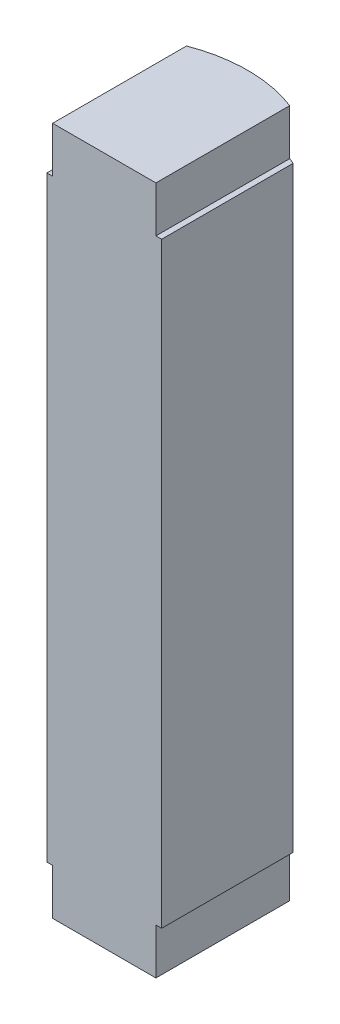
ISO-10303-21;
HEADER;
FILE_DESCRIPTION(('STEP AP214'),'2;1');
FILE_NAME('part.step','',(''),(''),'','','');
FILE_SCHEMA(('AUTOMOTIVE_DESIGN { 1 0 10303 214 1 1 1 1 }'));
ENDSEC;
DATA;
#1=APPLICATION_CONTEXT('core data for automotive mechanical design processes');
#2=APPLICATION_PROTOCOL_DEFINITION('international standard','automotive_design',2000,#1);
#3=PRODUCT_CONTEXT('',#1,'mechanical');
#4=PRODUCT('Part','Part','',(#3));
#5=PRODUCT_RELATED_PRODUCT_CATEGORY('part','',(#4));
#6=PRODUCT_DEFINITION_FORMATION('','',#4);
#7=PRODUCT_DEFINITION_CONTEXT('part definition',#1,'design');
#8=PRODUCT_DEFINITION('design','',#6,#7);
#9=PRODUCT_DEFINITION_SHAPE('','',#8);
#10=(LENGTH_UNIT() NAMED_UNIT(*) SI_UNIT(.MILLI.,.METRE.));
#11=(NAMED_UNIT(*) PLANE_ANGLE_UNIT() SI_UNIT($,.RADIAN.));
#12=(NAMED_UNIT(*) SI_UNIT($,.STERADIAN.) SOLID_ANGLE_UNIT());
#13=UNCERTAINTY_MEASURE_WITH_UNIT(LENGTH_MEASURE(1.E-05),#10,'distance_accuracy_value','');
#14=(GEOMETRIC_REPRESENTATION_CONTEXT(3) GLOBAL_UNCERTAINTY_ASSIGNED_CONTEXT((#13)) GLOBAL_UNIT_ASSIGNED_CONTEXT((#10,
#11,#12)) REPRESENTATION_CONTEXT('',''));
#15=CARTESIAN_POINT('',(0.,0.,0.));
#16=DIRECTION('',(0.,0.,1.));
#17=DIRECTION('',(1.,0.,0.));
#18=AXIS2_PLACEMENT_3D('',#15,#16,#17);
#19=CARTESIAN_POINT('',(-5.,60.,-11.4564392373896));
#20=DIRECTION('',(1.,0.,0.));
#21=DIRECTION('',(0.,0.,-1.));
#22=AXIS2_PLACEMENT_3D('',#19,#20,#21);
#23=PLANE('',#22);
#24=DIRECTION('',(0.,-1.,0.));
#25=VECTOR('',#24,1.);
#26=CARTESIAN_POINT('',(-5.,60.,0.));
#27=LINE('',#26,#25);
#28=CARTESIAN_POINT('',(-5.,56.,0.));
#29=VERTEX_POINT('',#28);
#30=CARTESIAN_POINT('',(-5.,4.,0.));
#31=VERTEX_POINT('',#30);
#32=EDGE_CURVE('E139',#29,#31,#27,.T.);
#33=ORIENTED_EDGE('',*,*,#32,.F.);
#34=DIRECTION('',(0.,0.,1.));
#35=VECTOR('',#34,1.);
#36=CARTESIAN_POINT('',(-5.,56.,-20.));
#37=LINE('',#36,#35);
#38=CARTESIAN_POINT('',(-5.,56.,-11.4564392373896));
#39=VERTEX_POINT('',#38);
#40=EDGE_CURVE('E125',#39,#29,#37,.T.);
#41=ORIENTED_EDGE('',*,*,#40,.F.);
#42=DIRECTION('',(0.,-1.,0.));
#43=VECTOR('',#42,1.);
#44=CARTESIAN_POINT('',(-5.,60.,-11.4564392373896));
#45=LINE('',#44,#43);
#46=CARTESIAN_POINT('',(-5.,4.,-11.4564392373896));
#47=VERTEX_POINT('',#46);
#48=EDGE_CURVE('E179',#39,#47,#45,.T.);
#49=ORIENTED_EDGE('',*,*,#48,.T.);
#50=DIRECTION('',(0.,0.,1.));
#51=VECTOR('',#50,1.);
#52=CARTESIAN_POINT('',(-5.,4.,-20.));
#53=LINE('',#52,#51);
#54=EDGE_CURVE('E144',#47,#31,#53,.T.);
#55=ORIENTED_EDGE('',*,*,#54,.T.);
#56=EDGE_LOOP('',(#33,#41,#49,#55));
#57=FACE_BOUND('',#56,.T.);
#58=ADVANCED_FACE('F35',(#57),#23,.F.);
#59=CARTESIAN_POINT('',(-5.,60.,0.));
#60=DIRECTION('',(0.,0.,-1.));
#61=DIRECTION('',(-1.,0.,0.));
#62=AXIS2_PLACEMENT_3D('',#59,#60,#61);
#63=PLANE('',#62);
#64=DIRECTION('',(1.,0.,0.));
#65=VECTOR('',#64,1.);
#66=CARTESIAN_POINT('',(-5.,60.,0.));
#67=LINE('',#66,#65);
#68=CARTESIAN_POINT('',(-4.5,60.,0.));
#69=VERTEX_POINT('',#68);
#70=CARTESIAN_POINT('',(4.5,60.,0.));
#71=VERTEX_POINT('',#70);
#72=EDGE_CURVE('E180',#69,#71,#67,.T.);
#73=ORIENTED_EDGE('',*,*,#72,.F.);
#74=DIRECTION('',(0.,1.,0.));
#75=VECTOR('',#74,1.);
#76=CARTESIAN_POINT('',(-4.5,60.,0.));
#77=LINE('',#76,#75);
#78=CARTESIAN_POINT('',(-4.5,56.,0.));
#79=VERTEX_POINT('',#78);
#80=EDGE_CURVE('E49',#79,#69,#77,.T.);
#81=ORIENTED_EDGE('',*,*,#80,.F.);
#82=DIRECTION('',(1.,0.,0.));
#83=VECTOR('',#82,1.);
#84=CARTESIAN_POINT('',(-5.,56.,0.));
#85=LINE('',#84,#83);
#86=EDGE_CURVE('E129',#29,#79,#85,.T.);
#87=ORIENTED_EDGE('',*,*,#86,.F.);
#88=ORIENTED_EDGE('',*,*,#32,.T.);
#89=DIRECTION('',(-1.,0.,0.));
#90=VECTOR('',#89,1.);
#91=CARTESIAN_POINT('',(-5.,4.,0.));
#92=LINE('',#91,#90);
#93=CARTESIAN_POINT('',(-4.5,4.,0.));
#94=VERTEX_POINT('',#93);
#95=EDGE_CURVE('E218',#94,#31,#92,.T.);
#96=ORIENTED_EDGE('',*,*,#95,.F.);
#97=DIRECTION('',(0.,1.,0.));
#98=VECTOR('',#97,1.);
#99=CARTESIAN_POINT('',(-4.5,0.,0.));
#100=LINE('',#99,#98);
#101=CARTESIAN_POINT('',(-4.5,0.,0.));
#102=VERTEX_POINT('',#101);
#103=EDGE_CURVE('E215',#102,#94,#100,.T.);
#104=ORIENTED_EDGE('',*,*,#103,.F.);
#105=DIRECTION('',(1.,0.,0.));
#106=VECTOR('',#105,1.);
#107=CARTESIAN_POINT('',(-5.,0.,0.));
#108=LINE('',#107,#106);
#109=CARTESIAN_POINT('',(4.5,0.,0.));
#110=VERTEX_POINT('',#109);
#111=EDGE_CURVE('E187',#102,#110,#108,.T.);
#112=ORIENTED_EDGE('',*,*,#111,.T.);
#113=DIRECTION('',(0.,-1.,0.));
#114=VECTOR('',#113,1.);
#115=CARTESIAN_POINT('',(4.5,0.,0.));
#116=LINE('',#115,#114);
#117=CARTESIAN_POINT('',(4.5,4.,0.));
#118=VERTEX_POINT('',#117);
#119=EDGE_CURVE('E207',#118,#110,#116,.T.);
#120=ORIENTED_EDGE('',*,*,#119,.F.);
#121=DIRECTION('',(-1.,0.,0.));
#122=VECTOR('',#121,1.);
#123=CARTESIAN_POINT('',(5.,4.,0.));
#124=LINE('',#123,#122);
#125=CARTESIAN_POINT('',(5.,4.,0.));
#126=VERTEX_POINT('',#125);
#127=EDGE_CURVE('E211',#126,#118,#124,.T.);
#128=ORIENTED_EDGE('',*,*,#127,.F.);
#129=DIRECTION('',(0.,-1.,0.));
#130=VECTOR('',#129,1.);
#131=CARTESIAN_POINT('',(5.,60.,0.));
#132=LINE('',#131,#130);
#133=CARTESIAN_POINT('',(5.,56.,0.));
#134=VERTEX_POINT('',#133);
#135=EDGE_CURVE('E146',#134,#126,#132,.T.);
#136=ORIENTED_EDGE('',*,*,#135,.F.);
#137=DIRECTION('',(1.,0.,0.));
#138=VECTOR('',#137,1.);
#139=CARTESIAN_POINT('',(5.,56.,0.));
#140=LINE('',#139,#138);
#141=CARTESIAN_POINT('',(4.5,56.,0.));
#142=VERTEX_POINT('',#141);
#143=EDGE_CURVE('E333',#142,#134,#140,.T.);
#144=ORIENTED_EDGE('',*,*,#143,.F.);
#145=DIRECTION('',(0.,-1.,0.));
#146=VECTOR('',#145,1.);
#147=CARTESIAN_POINT('',(4.5,60.,0.));
#148=LINE('',#147,#146);
#149=EDGE_CURVE('E176',#71,#142,#148,.T.);
#150=ORIENTED_EDGE('',*,*,#149,.F.);
#151=EDGE_LOOP('',(#73,#81,#87,#88,#96,#104,#112,#120,#128,#136,#144,#150));
#152=FACE_BOUND('',#151,.T.);
#153=ADVANCED_FACE('F137',(#152),#63,.F.);
#154=CARTESIAN_POINT('',(5.,60.,0.));
#155=DIRECTION('',(-1.,0.,0.));
#156=DIRECTION('',(0.,0.,1.));
#157=AXIS2_PLACEMENT_3D('',#154,#155,#156);
#158=PLANE('',#157);
#159=DIRECTION('',(0.,-1.,0.));
#160=VECTOR('',#159,1.);
#161=CARTESIAN_POINT('',(5.,60.,-11.4564392373896));
#162=LINE('',#161,#160);
#163=CARTESIAN_POINT('',(5.,56.,-11.4564392373896));
#164=VERTEX_POINT('',#163);
#165=CARTESIAN_POINT('',(5.,4.,-11.4564392373896));
#166=VERTEX_POINT('',#165);
#167=EDGE_CURVE('E151',#164,#166,#162,.T.);
#168=ORIENTED_EDGE('',*,*,#167,.F.);
#169=DIRECTION('',(0.,0.,1.));
#170=VECTOR('',#169,1.);
#171=CARTESIAN_POINT('',(5.,56.,-20.));
#172=LINE('',#171,#170);
#173=EDGE_CURVE('E338',#164,#134,#172,.T.);
#174=ORIENTED_EDGE('',*,*,#173,.T.);
#175=ORIENTED_EDGE('',*,*,#135,.T.);
#176=DIRECTION('',(0.,0.,1.));
#177=VECTOR('',#176,1.);
#178=CARTESIAN_POINT('',(5.,4.,-20.));
#179=LINE('',#178,#177);
#180=EDGE_CURVE('E202',#166,#126,#179,.T.);
#181=ORIENTED_EDGE('',*,*,#180,.F.);
#182=EDGE_LOOP('',(#168,#174,#175,#181));
#183=FACE_BOUND('',#182,.T.);
#184=ADVANCED_FACE('F205',(#183),#158,.F.);
#185=CARTESIAN_POINT('',(0.,60.,0.));
#186=DIRECTION('',(0.,-1.,0.));
#187=DIRECTION('',(0.,0.,-1.));
#188=AXIS2_PLACEMENT_3D('',#185,#186,#187);
#189=CYLINDRICAL_SURFACE('',#188,12.5);
#190=CARTESIAN_POINT('',(0.,56.,0.));
#191=DIRECTION('',(0.,-1.,0.));
#192=DIRECTION('',(0.,0.,-1.));
#193=AXIS2_PLACEMENT_3D('',#190,#191,#192);
#194=CIRCLE('',#193,12.5);
#195=CARTESIAN_POINT('',(-4.5,56.,-11.6619037896906));
#196=VERTEX_POINT('',#195);
#197=EDGE_CURVE('E11',#39,#196,#194,.T.);
#198=ORIENTED_EDGE('',*,*,#197,.T.);
#199=DIRECTION('',(0.,-1.,0.));
#200=VECTOR('',#199,1.);
#201=CARTESIAN_POINT('',(-4.5,60.,-11.6619037896906));
#202=LINE('',#201,#200);
#203=CARTESIAN_POINT('',(-4.5,60.,-11.6619037896906));
#204=VERTEX_POINT('',#203);
#205=EDGE_CURVE('E169',#196,#204,#202,.F.);
#206=ORIENTED_EDGE('',*,*,#205,.T.);
#207=CARTESIAN_POINT('',(0.,60.,0.));
#208=DIRECTION('',(0.,1.,0.));
#209=DIRECTION('',(0.,0.,1.));
#210=AXIS2_PLACEMENT_3D('',#207,#208,#209);
#211=CIRCLE('',#210,12.5);
#212=CARTESIAN_POINT('',(4.5,60.,-11.6619037896906));
#213=VERTEX_POINT('',#212);
#214=EDGE_CURVE('E175',#213,#204,#211,.T.);
#215=ORIENTED_EDGE('',*,*,#214,.F.);
#216=DIRECTION('',(0.,-1.,0.));
#217=VECTOR('',#216,1.);
#218=CARTESIAN_POINT('',(4.5,60.,-11.6619037896906));
#219=LINE('',#218,#217);
#220=CARTESIAN_POINT('',(4.5,56.,-11.6619037896906));
#221=VERTEX_POINT('',#220);
#222=EDGE_CURVE('E57',#213,#221,#219,.T.);
#223=ORIENTED_EDGE('',*,*,#222,.T.);
#224=CARTESIAN_POINT('',(0.,56.,0.));
#225=DIRECTION('',(0.,-1.,0.));
#226=DIRECTION('',(0.,0.,-1.));
#227=AXIS2_PLACEMENT_3D('',#224,#225,#226);
#228=CIRCLE('',#227,12.5);
#229=EDGE_CURVE('E165',#221,#164,#228,.T.);
#230=ORIENTED_EDGE('',*,*,#229,.T.);
#231=ORIENTED_EDGE('',*,*,#167,.T.);
#232=CARTESIAN_POINT('',(0.,4.,0.));
#233=DIRECTION('',(0.,1.,0.));
#234=DIRECTION('',(0.,0.,1.));
#235=AXIS2_PLACEMENT_3D('',#232,#233,#234);
#236=CIRCLE('',#235,12.5);
#237=CARTESIAN_POINT('',(4.5,4.,-11.6619037896906));
#238=VERTEX_POINT('',#237);
#239=EDGE_CURVE('E160',#166,#238,#236,.T.);
#240=ORIENTED_EDGE('',*,*,#239,.T.);
#241=DIRECTION('',(0.,-1.,0.));
#242=VECTOR('',#241,1.);
#243=CARTESIAN_POINT('',(4.5,60.,-11.6619037896906));
#244=LINE('',#243,#242);
#245=CARTESIAN_POINT('',(4.5,0.,-11.6619037896906));
#246=VERTEX_POINT('',#245);
#247=EDGE_CURVE('E209',#238,#246,#244,.T.);
#248=ORIENTED_EDGE('',*,*,#247,.T.);
#249=CARTESIAN_POINT('',(0.,0.,0.));
#250=DIRECTION('',(0.,1.,0.));
#251=DIRECTION('',(0.,0.,1.));
#252=AXIS2_PLACEMENT_3D('',#249,#250,#251);
#253=CIRCLE('',#252,12.5);
#254=CARTESIAN_POINT('',(-4.5,0.,-11.6619037896906));
#255=VERTEX_POINT('',#254);
#256=EDGE_CURVE('E183',#246,#255,#253,.T.);
#257=ORIENTED_EDGE('',*,*,#256,.T.);
#258=DIRECTION('',(0.,-1.,0.));
#259=VECTOR('',#258,1.);
#260=CARTESIAN_POINT('',(-4.5,60.,-11.6619037896906));
#261=LINE('',#260,#259);
#262=CARTESIAN_POINT('',(-4.5,4.,-11.6619037896906));
#263=VERTEX_POINT('',#262);
#264=EDGE_CURVE('E190',#255,#263,#261,.F.);
#265=ORIENTED_EDGE('',*,*,#264,.T.);
#266=CARTESIAN_POINT('',(0.,4.,0.));
#267=DIRECTION('',(0.,1.,0.));
#268=DIRECTION('',(0.,0.,1.));
#269=AXIS2_PLACEMENT_3D('',#266,#267,#268);
#270=CIRCLE('',#269,12.5);
#271=EDGE_CURVE('E149',#263,#47,#270,.T.);
#272=ORIENTED_EDGE('',*,*,#271,.T.);
#273=ORIENTED_EDGE('',*,*,#48,.F.);
#274=EDGE_LOOP('',(#198,#206,#215,#223,#230,#231,#240,#248,#257,#265,#272,#273));
#275=FACE_BOUND('',#274,.T.);
#276=ADVANCED_FACE('F174',(#275),#189,.T.);
#277=CARTESIAN_POINT('',(0.,60.,0.));
#278=DIRECTION('',(0.,1.,0.));
#279=DIRECTION('',(0.,0.,1.));
#280=AXIS2_PLACEMENT_3D('',#277,#278,#279);
#281=PLANE('',#280);
#282=DIRECTION('',(0.,0.,-1.));
#283=VECTOR('',#282,1.);
#284=CARTESIAN_POINT('',(-4.5,60.,0.));
#285=LINE('',#284,#283);
#286=EDGE_CURVE('E42',#69,#204,#285,.T.);
#287=ORIENTED_EDGE('',*,*,#286,.F.);
#288=ORIENTED_EDGE('',*,*,#72,.T.);
#289=DIRECTION('',(0.,0.,1.));
#290=VECTOR('',#289,1.);
#291=CARTESIAN_POINT('',(4.5,60.,0.));
#292=LINE('',#291,#290);
#293=EDGE_CURVE('E163',#213,#71,#292,.T.);
#294=ORIENTED_EDGE('',*,*,#293,.F.);
#295=ORIENTED_EDGE('',*,*,#214,.T.);
#296=EDGE_LOOP('',(#287,#288,#294,#295));
#297=FACE_BOUND('',#296,.T.);
#298=ADVANCED_FACE('F178',(#297),#281,.T.);
#299=CARTESIAN_POINT('',(0.,0.,0.));
#300=DIRECTION('',(0.,1.,0.));
#301=DIRECTION('',(0.,0.,1.));
#302=AXIS2_PLACEMENT_3D('',#299,#300,#301);
#303=PLANE('',#302);
#304=ORIENTED_EDGE('',*,*,#256,.F.);
#305=DIRECTION('',(0.,0.,1.));
#306=VECTOR('',#305,1.);
#307=CARTESIAN_POINT('',(4.5,0.,0.));
#308=LINE('',#307,#306);
#309=EDGE_CURVE('E157',#246,#110,#308,.T.);
#310=ORIENTED_EDGE('',*,*,#309,.T.);
#311=ORIENTED_EDGE('',*,*,#111,.F.);
#312=DIRECTION('',(0.,0.,-1.));
#313=VECTOR('',#312,1.);
#314=CARTESIAN_POINT('',(-4.5,0.,0.));
#315=LINE('',#314,#313);
#316=EDGE_CURVE('E145',#102,#255,#315,.T.);
#317=ORIENTED_EDGE('',*,*,#316,.T.);
#318=EDGE_LOOP('',(#304,#310,#311,#317));
#319=FACE_BOUND('',#318,.T.);
#320=ADVANCED_FACE('F231',(#319),#303,.F.);
#321=CARTESIAN_POINT('',(-5.,4.,-20.));
#322=DIRECTION('',(0.,1.,0.));
#323=DIRECTION('',(0.,0.,1.));
#324=AXIS2_PLACEMENT_3D('',#321,#322,#323);
#325=PLANE('',#324);
#326=DIRECTION('',(0.,0.,1.));
#327=VECTOR('',#326,1.);
#328=CARTESIAN_POINT('',(-4.5,4.,-20.));
#329=LINE('',#328,#327);
#330=EDGE_CURVE('E220',#263,#94,#329,.T.);
#331=ORIENTED_EDGE('',*,*,#330,.T.);
#332=ORIENTED_EDGE('',*,*,#95,.T.);
#333=ORIENTED_EDGE('',*,*,#54,.F.);
#334=ORIENTED_EDGE('',*,*,#271,.F.);
#335=EDGE_LOOP('',(#331,#332,#333,#334));
#336=FACE_BOUND('',#335,.T.);
#337=ADVANCED_FACE('F234',(#336),#325,.F.);
#338=CARTESIAN_POINT('',(-4.5,0.,-20.));
#339=DIRECTION('',(1.,0.,0.));
#340=DIRECTION('',(0.,0.,-1.));
#341=AXIS2_PLACEMENT_3D('',#338,#339,#340);
#342=PLANE('',#341);
#343=ORIENTED_EDGE('',*,*,#316,.F.);
#344=ORIENTED_EDGE('',*,*,#103,.T.);
#345=ORIENTED_EDGE('',*,*,#330,.F.);
#346=ORIENTED_EDGE('',*,*,#264,.F.);
#347=EDGE_LOOP('',(#343,#344,#345,#346));
#348=FACE_BOUND('',#347,.T.);
#349=ADVANCED_FACE('F227',(#348),#342,.F.);
#350=CARTESIAN_POINT('',(5.,4.,-20.));
#351=DIRECTION('',(0.,1.,0.));
#352=DIRECTION('',(0.,0.,1.));
#353=AXIS2_PLACEMENT_3D('',#350,#351,#352);
#354=PLANE('',#353);
#355=ORIENTED_EDGE('',*,*,#180,.T.);
#356=ORIENTED_EDGE('',*,*,#127,.T.);
#357=DIRECTION('',(0.,0.,1.));
#358=VECTOR('',#357,1.);
#359=CARTESIAN_POINT('',(4.5,4.,-20.));
#360=LINE('',#359,#358);
#361=EDGE_CURVE('E204',#238,#118,#360,.T.);
#362=ORIENTED_EDGE('',*,*,#361,.F.);
#363=ORIENTED_EDGE('',*,*,#239,.F.);
#364=EDGE_LOOP('',(#355,#356,#362,#363));
#365=FACE_BOUND('',#364,.T.);
#366=ADVANCED_FACE('F200',(#365),#354,.F.);
#367=CARTESIAN_POINT('',(4.5,0.,-20.));
#368=DIRECTION('',(-1.,0.,0.));
#369=DIRECTION('',(0.,0.,1.));
#370=AXIS2_PLACEMENT_3D('',#367,#368,#369);
#371=PLANE('',#370);
#372=ORIENTED_EDGE('',*,*,#361,.T.);
#373=ORIENTED_EDGE('',*,*,#119,.T.);
#374=ORIENTED_EDGE('',*,*,#309,.F.);
#375=ORIENTED_EDGE('',*,*,#247,.F.);
#376=EDGE_LOOP('',(#372,#373,#374,#375));
#377=FACE_BOUND('',#376,.T.);
#378=ADVANCED_FACE('F283',(#377),#371,.F.);
#379=CARTESIAN_POINT('',(5.,56.,-20.));
#380=DIRECTION('',(0.,-1.,0.));
#381=DIRECTION('',(0.,0.,-1.));
#382=AXIS2_PLACEMENT_3D('',#379,#380,#381);
#383=PLANE('',#382);
#384=DIRECTION('',(0.,0.,1.));
#385=VECTOR('',#384,1.);
#386=CARTESIAN_POINT('',(4.5,56.,-20.));
#387=LINE('',#386,#385);
#388=EDGE_CURVE('E335',#221,#142,#387,.T.);
#389=ORIENTED_EDGE('',*,*,#388,.T.);
#390=ORIENTED_EDGE('',*,*,#143,.T.);
#391=ORIENTED_EDGE('',*,*,#173,.F.);
#392=ORIENTED_EDGE('',*,*,#229,.F.);
#393=EDGE_LOOP('',(#389,#390,#391,#392));
#394=FACE_BOUND('',#393,.T.);
#395=ADVANCED_FACE('F291',(#394),#383,.F.);
#396=CARTESIAN_POINT('',(4.5,60.,-20.));
#397=DIRECTION('',(-1.,0.,0.));
#398=DIRECTION('',(0.,0.,1.));
#399=AXIS2_PLACEMENT_3D('',#396,#397,#398);
#400=PLANE('',#399);
#401=ORIENTED_EDGE('',*,*,#293,.T.);
#402=ORIENTED_EDGE('',*,*,#149,.T.);
#403=ORIENTED_EDGE('',*,*,#388,.F.);
#404=ORIENTED_EDGE('',*,*,#222,.F.);
#405=EDGE_LOOP('',(#401,#402,#403,#404));
#406=FACE_BOUND('',#405,.T.);
#407=ADVANCED_FACE('F301',(#406),#400,.F.);
#408=CARTESIAN_POINT('',(-5.,56.,-20.));
#409=DIRECTION('',(0.,-1.,0.));
#410=DIRECTION('',(0.,0.,-1.));
#411=AXIS2_PLACEMENT_3D('',#408,#409,#410);
#412=PLANE('',#411);
#413=ORIENTED_EDGE('',*,*,#40,.T.);
#414=ORIENTED_EDGE('',*,*,#86,.T.);
#415=DIRECTION('',(0.,0.,1.));
#416=VECTOR('',#415,1.);
#417=CARTESIAN_POINT('',(-4.5,56.,-20.));
#418=LINE('',#417,#416);
#419=EDGE_CURVE('E133',#196,#79,#418,.T.);
#420=ORIENTED_EDGE('',*,*,#419,.F.);
#421=ORIENTED_EDGE('',*,*,#197,.F.);
#422=EDGE_LOOP('',(#413,#414,#420,#421));
#423=FACE_BOUND('',#422,.T.);
#424=ADVANCED_FACE('F127',(#423),#412,.F.);
#425=CARTESIAN_POINT('',(-4.5,60.,-20.));
#426=DIRECTION('',(1.,0.,0.));
#427=DIRECTION('',(0.,0.,-1.));
#428=AXIS2_PLACEMENT_3D('',#425,#426,#427);
#429=PLANE('',#428);
#430=ORIENTED_EDGE('',*,*,#419,.T.);
#431=ORIENTED_EDGE('',*,*,#80,.T.);
#432=ORIENTED_EDGE('',*,*,#286,.T.);
#433=ORIENTED_EDGE('',*,*,#205,.F.);
#434=EDGE_LOOP('',(#430,#431,#432,#433));
#435=FACE_BOUND('',#434,.T.);
#436=ADVANCED_FACE('F168',(#435),#429,.F.);
#437=CLOSED_SHELL('',(#58,#153,#184,#276,#298,#320,#337,#349,#366,#378,#395,#407,#424,#436));
#438=MANIFOLD_SOLID_BREP('B2',#437);
#439=ADVANCED_BREP_SHAPE_REPRESENTATION('',(#18,#438),#14);
#440=SHAPE_DEFINITION_REPRESENTATION(#9,#439);
ENDSEC;
END-ISO-10303-21;
